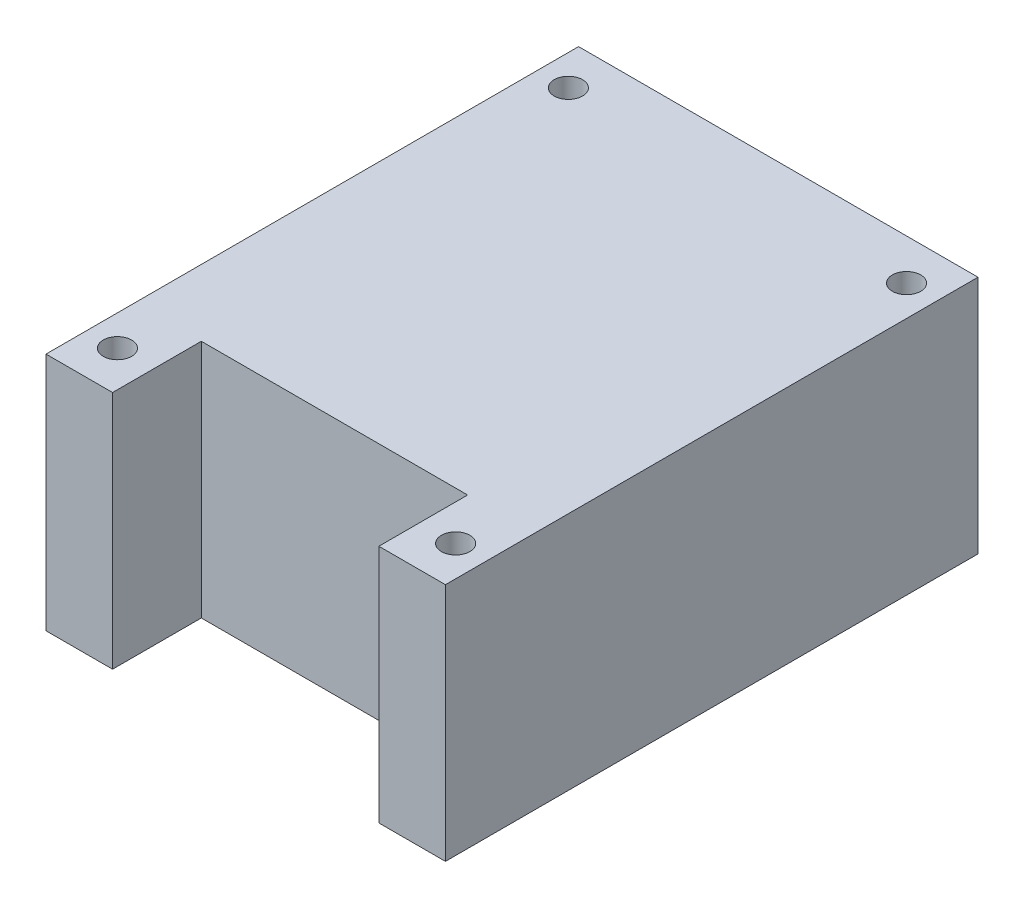
ISO-10303-21;
HEADER;
FILE_DESCRIPTION(('STEP AP214'),'2;1');
FILE_NAME('part.step','',(''),(''),'','','');
FILE_SCHEMA(('AUTOMOTIVE_DESIGN { 1 0 10303 214 1 1 1 1 }'));
ENDSEC;
DATA;
#1=APPLICATION_CONTEXT('core data for automotive mechanical design processes');
#2=APPLICATION_PROTOCOL_DEFINITION('international standard','automotive_design',2000,#1);
#3=PRODUCT_CONTEXT('',#1,'mechanical');
#4=PRODUCT('Part','Part','',(#3));
#5=PRODUCT_RELATED_PRODUCT_CATEGORY('part','',(#4));
#6=PRODUCT_DEFINITION_FORMATION('','',#4);
#7=PRODUCT_DEFINITION_CONTEXT('part definition',#1,'design');
#8=PRODUCT_DEFINITION('design','',#6,#7);
#9=PRODUCT_DEFINITION_SHAPE('','',#8);
#10=(LENGTH_UNIT() NAMED_UNIT(*) SI_UNIT(.MILLI.,.METRE.));
#11=(NAMED_UNIT(*) PLANE_ANGLE_UNIT() SI_UNIT($,.RADIAN.));
#12=(NAMED_UNIT(*) SI_UNIT($,.STERADIAN.) SOLID_ANGLE_UNIT());
#13=UNCERTAINTY_MEASURE_WITH_UNIT(LENGTH_MEASURE(1.E-05),#10,'distance_accuracy_value','');
#14=(GEOMETRIC_REPRESENTATION_CONTEXT(3) GLOBAL_UNCERTAINTY_ASSIGNED_CONTEXT((#13)) GLOBAL_UNIT_ASSIGNED_CONTEXT((#10,
#11,#12)) REPRESENTATION_CONTEXT('',''));
#15=CARTESIAN_POINT('',(0.,0.,0.));
#16=DIRECTION('',(0.,0.,1.));
#17=DIRECTION('',(1.,0.,0.));
#18=AXIS2_PLACEMENT_3D('',#15,#16,#17);
#19=CARTESIAN_POINT('',(-22.5,27.,30.));
#20=DIRECTION('',(0.,0.,-1.));
#21=DIRECTION('',(-1.,0.,0.));
#22=AXIS2_PLACEMENT_3D('',#19,#20,#21);
#23=PLANE('',#22);
#24=DIRECTION('',(1.,0.,0.));
#25=VECTOR('',#24,1.);
#26=CARTESIAN_POINT('',(-22.5,27.,30.));
#27=LINE('',#26,#25);
#28=CARTESIAN_POINT('',(15.,27.,30.));
#29=VERTEX_POINT('',#28);
#30=CARTESIAN_POINT('',(22.5,27.,30.));
#31=VERTEX_POINT('',#30);
#32=EDGE_CURVE('E64',#29,#31,#27,.T.);
#33=ORIENTED_EDGE('',*,*,#32,.F.);
#34=DIRECTION('',(0.,-1.,0.));
#35=VECTOR('',#34,1.);
#36=CARTESIAN_POINT('',(15.,58.6227766016838,30.));
#37=LINE('',#36,#35);
#38=CARTESIAN_POINT('',(15.,0.,30.));
#39=VERTEX_POINT('',#38);
#40=EDGE_CURVE('E117',#29,#39,#37,.T.);
#41=ORIENTED_EDGE('',*,*,#40,.T.);
#42=DIRECTION('',(1.,0.,0.));
#43=VECTOR('',#42,1.);
#44=CARTESIAN_POINT('',(-22.5,0.,30.));
#45=LINE('',#44,#43);
#46=CARTESIAN_POINT('',(22.5,0.,30.));
#47=VERTEX_POINT('',#46);
#48=EDGE_CURVE('E86',#39,#47,#45,.T.);
#49=ORIENTED_EDGE('',*,*,#48,.T.);
#50=DIRECTION('',(0.,-1.,0.));
#51=VECTOR('',#50,1.);
#52=CARTESIAN_POINT('',(22.5,27.,30.));
#53=LINE('',#52,#51);
#54=EDGE_CURVE('E146',#31,#47,#53,.T.);
#55=ORIENTED_EDGE('',*,*,#54,.F.);
#56=EDGE_LOOP('',(#33,#41,#49,#55));
#57=FACE_BOUND('',#56,.T.);
#58=ADVANCED_FACE('F39',(#57),#23,.F.);
#59=CARTESIAN_POINT('',(22.5,27.,30.));
#60=DIRECTION('',(-1.,0.,0.));
#61=DIRECTION('',(0.,0.,1.));
#62=AXIS2_PLACEMENT_3D('',#59,#60,#61);
#63=PLANE('',#62);
#64=DIRECTION('',(0.,0.,-1.));
#65=VECTOR('',#64,1.);
#66=CARTESIAN_POINT('',(22.5,0.,30.));
#67=LINE('',#66,#65);
#68=CARTESIAN_POINT('',(22.5,0.,-30.));
#69=VERTEX_POINT('',#68);
#70=EDGE_CURVE('E133',#47,#69,#67,.T.);
#71=ORIENTED_EDGE('',*,*,#70,.T.);
#72=DIRECTION('',(0.,-1.,0.));
#73=VECTOR('',#72,1.);
#74=CARTESIAN_POINT('',(22.5,27.,-30.));
#75=LINE('',#74,#73);
#76=CARTESIAN_POINT('',(22.5,27.,-30.));
#77=VERTEX_POINT('',#76);
#78=EDGE_CURVE('E11',#77,#69,#75,.T.);
#79=ORIENTED_EDGE('',*,*,#78,.F.);
#80=DIRECTION('',(0.,0.,-1.));
#81=VECTOR('',#80,1.);
#82=CARTESIAN_POINT('',(22.5,27.,30.));
#83=LINE('',#82,#81);
#84=EDGE_CURVE('E141',#31,#77,#83,.T.);
#85=ORIENTED_EDGE('',*,*,#84,.F.);
#86=ORIENTED_EDGE('',*,*,#54,.T.);
#87=EDGE_LOOP('',(#71,#79,#85,#86));
#88=FACE_BOUND('',#87,.T.);
#89=ADVANCED_FACE('F41',(#88),#63,.F.);
#90=CARTESIAN_POINT('',(-22.5,27.,-30.));
#91=DIRECTION('',(0.,0.,1.));
#92=DIRECTION('',(1.,0.,0.));
#93=AXIS2_PLACEMENT_3D('',#90,#91,#92);
#94=PLANE('',#93);
#95=DIRECTION('',(-1.,0.,0.));
#96=VECTOR('',#95,1.);
#97=CARTESIAN_POINT('',(-22.5,0.,-30.));
#98=LINE('',#97,#96);
#99=CARTESIAN_POINT('',(-22.5,0.,-30.));
#100=VERTEX_POINT('',#99);
#101=EDGE_CURVE('E142',#69,#100,#98,.T.);
#102=ORIENTED_EDGE('',*,*,#101,.T.);
#103=DIRECTION('',(0.,-1.,0.));
#104=VECTOR('',#103,1.);
#105=CARTESIAN_POINT('',(-22.5,27.,-30.));
#106=LINE('',#105,#104);
#107=CARTESIAN_POINT('',(-22.5,27.,-30.));
#108=VERTEX_POINT('',#107);
#109=EDGE_CURVE('E48',#108,#100,#106,.T.);
#110=ORIENTED_EDGE('',*,*,#109,.F.);
#111=DIRECTION('',(-1.,0.,0.));
#112=VECTOR('',#111,1.);
#113=CARTESIAN_POINT('',(-22.5,27.,-30.));
#114=LINE('',#113,#112);
#115=EDGE_CURVE('E93',#77,#108,#114,.T.);
#116=ORIENTED_EDGE('',*,*,#115,.F.);
#117=ORIENTED_EDGE('',*,*,#78,.T.);
#118=EDGE_LOOP('',(#102,#110,#116,#117));
#119=FACE_BOUND('',#118,.T.);
#120=ADVANCED_FACE('F176',(#119),#94,.F.);
#121=CARTESIAN_POINT('',(-22.5,27.,30.));
#122=DIRECTION('',(1.,0.,0.));
#123=DIRECTION('',(0.,0.,-1.));
#124=AXIS2_PLACEMENT_3D('',#121,#122,#123);
#125=PLANE('',#124);
#126=DIRECTION('',(0.,0.,1.));
#127=VECTOR('',#126,1.);
#128=CARTESIAN_POINT('',(-22.5,0.,30.));
#129=LINE('',#128,#127);
#130=CARTESIAN_POINT('',(-22.5,0.,30.));
#131=VERTEX_POINT('',#130);
#132=EDGE_CURVE('E136',#100,#131,#129,.T.);
#133=ORIENTED_EDGE('',*,*,#132,.T.);
#134=DIRECTION('',(0.,-1.,0.));
#135=VECTOR('',#134,1.);
#136=CARTESIAN_POINT('',(-22.5,27.,30.));
#137=LINE('',#136,#135);
#138=CARTESIAN_POINT('',(-22.5,27.,30.));
#139=VERTEX_POINT('',#138);
#140=EDGE_CURVE('E149',#139,#131,#137,.T.);
#141=ORIENTED_EDGE('',*,*,#140,.F.);
#142=DIRECTION('',(0.,0.,1.));
#143=VECTOR('',#142,1.);
#144=CARTESIAN_POINT('',(-22.5,27.,30.));
#145=LINE('',#144,#143);
#146=EDGE_CURVE('E160',#108,#139,#145,.T.);
#147=ORIENTED_EDGE('',*,*,#146,.F.);
#148=ORIENTED_EDGE('',*,*,#109,.T.);
#149=EDGE_LOOP('',(#133,#141,#147,#148));
#150=FACE_BOUND('',#149,.T.);
#151=ADVANCED_FACE('F158',(#150),#125,.F.);
#152=CARTESIAN_POINT('',(-15.,0.,30.));
#153=VERTEX_POINT('',#152);
#154=EDGE_CURVE('E135',#131,#153,#45,.T.);
#155=ORIENTED_EDGE('',*,*,#154,.T.);
#156=DIRECTION('',(0.,-1.,0.));
#157=VECTOR('',#156,1.);
#158=CARTESIAN_POINT('',(-15.,58.6227766016838,30.));
#159=LINE('',#158,#157);
#160=CARTESIAN_POINT('',(-15.,27.,30.));
#161=VERTEX_POINT('',#160);
#162=EDGE_CURVE('E55',#161,#153,#159,.T.);
#163=ORIENTED_EDGE('',*,*,#162,.F.);
#164=EDGE_CURVE('E150',#139,#161,#27,.T.);
#165=ORIENTED_EDGE('',*,*,#164,.F.);
#166=ORIENTED_EDGE('',*,*,#140,.T.);
#167=EDGE_LOOP('',(#155,#163,#165,#166));
#168=FACE_BOUND('',#167,.T.);
#169=ADVANCED_FACE('F163',(#168),#23,.F.);
#170=CARTESIAN_POINT('',(0.,27.,0.));
#171=DIRECTION('',(0.,-1.,0.));
#172=DIRECTION('',(0.,0.,-1.));
#173=AXIS2_PLACEMENT_3D('',#170,#171,#172);
#174=PLANE('',#173);
#175=CARTESIAN_POINT('',(-19.05,27.,-25.4));
#176=DIRECTION('',(0.,1.,0.));
#177=DIRECTION('',(0.,0.,1.));
#178=AXIS2_PLACEMENT_3D('',#175,#176,#177);
#179=CIRCLE('',#178,1.6);
#180=CARTESIAN_POINT('',(-19.05,27.,-23.8));
#181=VERTEX_POINT('',#180);
#182=EDGE_CURVE('E211',#181,#181,#179,.T.);
#183=ORIENTED_EDGE('',*,*,#182,.F.);
#184=EDGE_LOOP('',(#183));
#185=FACE_BOUND('',#184,.T.);
#186=CARTESIAN_POINT('',(19.05,27.,-25.4));
#187=DIRECTION('',(0.,1.,0.));
#188=DIRECTION('',(0.,0.,1.));
#189=AXIS2_PLACEMENT_3D('',#186,#187,#188);
#190=CIRCLE('',#189,1.6);
#191=CARTESIAN_POINT('',(19.05,27.,-23.8));
#192=VERTEX_POINT('',#191);
#193=EDGE_CURVE('E203',#192,#192,#190,.T.);
#194=ORIENTED_EDGE('',*,*,#193,.F.);
#195=EDGE_LOOP('',(#194));
#196=FACE_BOUND('',#195,.T.);
#197=CARTESIAN_POINT('',(19.05,27.,25.4));
#198=DIRECTION('',(0.,1.,0.));
#199=DIRECTION('',(0.,0.,1.));
#200=AXIS2_PLACEMENT_3D('',#197,#198,#199);
#201=CIRCLE('',#200,1.6);
#202=CARTESIAN_POINT('',(19.05,27.,27.));
#203=VERTEX_POINT('',#202);
#204=EDGE_CURVE('E195',#203,#203,#201,.T.);
#205=ORIENTED_EDGE('',*,*,#204,.F.);
#206=EDGE_LOOP('',(#205));
#207=FACE_BOUND('',#206,.T.);
#208=CARTESIAN_POINT('',(-19.05,27.,25.4));
#209=DIRECTION('',(0.,1.,0.));
#210=DIRECTION('',(0.,0.,1.));
#211=AXIS2_PLACEMENT_3D('',#208,#209,#210);
#212=CIRCLE('',#211,1.6);
#213=CARTESIAN_POINT('',(-19.05,27.,27.));
#214=VERTEX_POINT('',#213);
#215=EDGE_CURVE('E187',#214,#214,#212,.T.);
#216=ORIENTED_EDGE('',*,*,#215,.F.);
#217=EDGE_LOOP('',(#216));
#218=FACE_BOUND('',#217,.T.);
#219=DIRECTION('',(-1.,0.,0.));
#220=VECTOR('',#219,1.);
#221=CARTESIAN_POINT('',(-15.,27.,20.));
#222=LINE('',#221,#220);
#223=CARTESIAN_POINT('',(15.,27.,20.));
#224=VERTEX_POINT('',#223);
#225=CARTESIAN_POINT('',(-15.,27.,20.));
#226=VERTEX_POINT('',#225);
#227=EDGE_CURVE('E230',#224,#226,#222,.T.);
#228=ORIENTED_EDGE('',*,*,#227,.F.);
#229=DIRECTION('',(0.,0.,-1.));
#230=VECTOR('',#229,1.);
#231=CARTESIAN_POINT('',(15.,27.,20.));
#232=LINE('',#231,#230);
#233=EDGE_CURVE('E214',#29,#224,#232,.T.);
#234=ORIENTED_EDGE('',*,*,#233,.F.);
#235=ORIENTED_EDGE('',*,*,#32,.T.);
#236=ORIENTED_EDGE('',*,*,#84,.T.);
#237=ORIENTED_EDGE('',*,*,#115,.T.);
#238=ORIENTED_EDGE('',*,*,#146,.T.);
#239=ORIENTED_EDGE('',*,*,#164,.T.);
#240=DIRECTION('',(0.,0.,1.));
#241=VECTOR('',#240,1.);
#242=CARTESIAN_POINT('',(-15.,27.,20.));
#243=LINE('',#242,#241);
#244=EDGE_CURVE('E223',#226,#161,#243,.T.);
#245=ORIENTED_EDGE('',*,*,#244,.F.);
#246=EDGE_LOOP('',(#228,#234,#235,#236,#237,#238,#239,#245));
#247=FACE_BOUND('',#246,.T.);
#248=ADVANCED_FACE('F237',(#185,#196,#207,#218,#247),#174,.F.);
#249=CARTESIAN_POINT('',(0.,0.,0.));
#250=DIRECTION('',(0.,-1.,0.));
#251=DIRECTION('',(0.,0.,-1.));
#252=AXIS2_PLACEMENT_3D('',#249,#250,#251);
#253=PLANE('',#252);
#254=DIRECTION('',(0.,0.,1.));
#255=VECTOR('',#254,1.);
#256=CARTESIAN_POINT('',(15.,0.,20.));
#257=LINE('',#256,#255);
#258=CARTESIAN_POINT('',(15.,0.,20.));
#259=VERTEX_POINT('',#258);
#260=EDGE_CURVE('E115',#259,#39,#257,.T.);
#261=ORIENTED_EDGE('',*,*,#260,.F.);
#262=DIRECTION('',(1.,0.,0.));
#263=VECTOR('',#262,1.);
#264=CARTESIAN_POINT('',(-15.,0.,20.));
#265=LINE('',#264,#263);
#266=CARTESIAN_POINT('',(-15.,0.,20.));
#267=VERTEX_POINT('',#266);
#268=EDGE_CURVE('E127',#267,#259,#265,.T.);
#269=ORIENTED_EDGE('',*,*,#268,.F.);
#270=DIRECTION('',(0.,0.,-1.));
#271=VECTOR('',#270,1.);
#272=CARTESIAN_POINT('',(-15.,0.,20.));
#273=LINE('',#272,#271);
#274=EDGE_CURVE('E124',#153,#267,#273,.T.);
#275=ORIENTED_EDGE('',*,*,#274,.F.);
#276=ORIENTED_EDGE('',*,*,#154,.F.);
#277=ORIENTED_EDGE('',*,*,#132,.F.);
#278=ORIENTED_EDGE('',*,*,#101,.F.);
#279=ORIENTED_EDGE('',*,*,#70,.F.);
#280=ORIENTED_EDGE('',*,*,#48,.F.);
#281=EDGE_LOOP('',(#261,#269,#275,#276,#277,#278,#279,#280));
#282=FACE_BOUND('',#281,.T.);
#283=CARTESIAN_POINT('',(-19.05,0.,-25.4));
#284=DIRECTION('',(0.,1.,0.));
#285=DIRECTION('',(0.,0.,1.));
#286=AXIS2_PLACEMENT_3D('',#283,#284,#285);
#287=CIRCLE('',#286,1.59999999999999);
#288=CARTESIAN_POINT('',(-19.05,0.,-23.8));
#289=VERTEX_POINT('',#288);
#290=EDGE_CURVE('E207',#289,#289,#287,.T.);
#291=ORIENTED_EDGE('',*,*,#290,.T.);
#292=EDGE_LOOP('',(#291));
#293=FACE_BOUND('',#292,.T.);
#294=CARTESIAN_POINT('',(19.05,0.,-25.4));
#295=DIRECTION('',(0.,1.,0.));
#296=DIRECTION('',(0.,0.,1.));
#297=AXIS2_PLACEMENT_3D('',#294,#295,#296);
#298=CIRCLE('',#297,1.59999999999999);
#299=CARTESIAN_POINT('',(19.05,0.,-23.8));
#300=VERTEX_POINT('',#299);
#301=EDGE_CURVE('E199',#300,#300,#298,.T.);
#302=ORIENTED_EDGE('',*,*,#301,.T.);
#303=EDGE_LOOP('',(#302));
#304=FACE_BOUND('',#303,.T.);
#305=CARTESIAN_POINT('',(19.05,0.,25.4));
#306=DIRECTION('',(0.,1.,0.));
#307=DIRECTION('',(0.,0.,1.));
#308=AXIS2_PLACEMENT_3D('',#305,#306,#307);
#309=CIRCLE('',#308,1.59999999999999);
#310=CARTESIAN_POINT('',(19.05,0.,27.));
#311=VERTEX_POINT('',#310);
#312=EDGE_CURVE('E191',#311,#311,#309,.T.);
#313=ORIENTED_EDGE('',*,*,#312,.T.);
#314=EDGE_LOOP('',(#313));
#315=FACE_BOUND('',#314,.T.);
#316=CARTESIAN_POINT('',(-19.05,0.,25.4));
#317=DIRECTION('',(0.,1.,0.));
#318=DIRECTION('',(0.,0.,1.));
#319=AXIS2_PLACEMENT_3D('',#316,#317,#318);
#320=CIRCLE('',#319,1.59999999999999);
#321=CARTESIAN_POINT('',(-19.05,0.,27.));
#322=VERTEX_POINT('',#321);
#323=EDGE_CURVE('E174',#322,#322,#320,.T.);
#324=ORIENTED_EDGE('',*,*,#323,.T.);
#325=EDGE_LOOP('',(#324));
#326=FACE_BOUND('',#325,.T.);
#327=ADVANCED_FACE('F130',(#282,#293,#304,#315,#326),#253,.T.);
#328=CARTESIAN_POINT('',(-19.05,27.,25.4));
#329=DIRECTION('',(0.,1.,0.));
#330=DIRECTION('',(0.,0.,1.));
#331=AXIS2_PLACEMENT_3D('',#328,#329,#330);
#332=CYLINDRICAL_SURFACE('',#331,1.6);
#333=ORIENTED_EDGE('',*,*,#323,.F.);
#334=EDGE_LOOP('',(#333));
#335=FACE_BOUND('',#334,.T.);
#336=ORIENTED_EDGE('',*,*,#215,.T.);
#337=EDGE_LOOP('',(#336));
#338=FACE_BOUND('',#337,.T.);
#339=ADVANCED_FACE('F298',(#335,#338),#332,.F.);
#340=CARTESIAN_POINT('',(19.05,27.,25.4));
#341=DIRECTION('',(0.,1.,0.));
#342=DIRECTION('',(0.,0.,1.));
#343=AXIS2_PLACEMENT_3D('',#340,#341,#342);
#344=CYLINDRICAL_SURFACE('',#343,1.6);
#345=ORIENTED_EDGE('',*,*,#312,.F.);
#346=EDGE_LOOP('',(#345));
#347=FACE_BOUND('',#346,.T.);
#348=ORIENTED_EDGE('',*,*,#204,.T.);
#349=EDGE_LOOP('',(#348));
#350=FACE_BOUND('',#349,.T.);
#351=ADVANCED_FACE('F305',(#347,#350),#344,.F.);
#352=CARTESIAN_POINT('',(19.05,27.,-25.4));
#353=DIRECTION('',(0.,1.,0.));
#354=DIRECTION('',(0.,0.,1.));
#355=AXIS2_PLACEMENT_3D('',#352,#353,#354);
#356=CYLINDRICAL_SURFACE('',#355,1.6);
#357=ORIENTED_EDGE('',*,*,#301,.F.);
#358=EDGE_LOOP('',(#357));
#359=FACE_BOUND('',#358,.T.);
#360=ORIENTED_EDGE('',*,*,#193,.T.);
#361=EDGE_LOOP('',(#360));
#362=FACE_BOUND('',#361,.T.);
#363=ADVANCED_FACE('F314',(#359,#362),#356,.F.);
#364=CARTESIAN_POINT('',(-19.05,27.,-25.4));
#365=DIRECTION('',(0.,1.,0.));
#366=DIRECTION('',(0.,0.,1.));
#367=AXIS2_PLACEMENT_3D('',#364,#365,#366);
#368=CYLINDRICAL_SURFACE('',#367,1.6);
#369=ORIENTED_EDGE('',*,*,#290,.F.);
#370=EDGE_LOOP('',(#369));
#371=FACE_BOUND('',#370,.T.);
#372=ORIENTED_EDGE('',*,*,#182,.T.);
#373=EDGE_LOOP('',(#372));
#374=FACE_BOUND('',#373,.T.);
#375=ADVANCED_FACE('F247',(#371,#374),#368,.F.);
#376=CARTESIAN_POINT('',(15.,58.6227766016838,20.));
#377=DIRECTION('',(1.,0.,0.));
#378=DIRECTION('',(0.,0.,-1.));
#379=AXIS2_PLACEMENT_3D('',#376,#377,#378);
#380=PLANE('',#379);
#381=ORIENTED_EDGE('',*,*,#233,.T.);
#382=DIRECTION('',(0.,-1.,0.));
#383=VECTOR('',#382,1.);
#384=CARTESIAN_POINT('',(15.,58.6227766016838,20.));
#385=LINE('',#384,#383);
#386=EDGE_CURVE('E119',#224,#259,#385,.T.);
#387=ORIENTED_EDGE('',*,*,#386,.T.);
#388=ORIENTED_EDGE('',*,*,#260,.T.);
#389=ORIENTED_EDGE('',*,*,#40,.F.);
#390=EDGE_LOOP('',(#381,#387,#388,#389));
#391=FACE_BOUND('',#390,.T.);
#392=ADVANCED_FACE('F116',(#391),#380,.F.);
#393=CARTESIAN_POINT('',(-15.,58.6227766016838,20.));
#394=DIRECTION('',(0.,0.,-1.));
#395=DIRECTION('',(-1.,0.,0.));
#396=AXIS2_PLACEMENT_3D('',#393,#394,#395);
#397=PLANE('',#396);
#398=ORIENTED_EDGE('',*,*,#227,.T.);
#399=DIRECTION('',(0.,-1.,0.));
#400=VECTOR('',#399,1.);
#401=CARTESIAN_POINT('',(-15.,58.6227766016838,20.));
#402=LINE('',#401,#400);
#403=EDGE_CURVE('E218',#226,#267,#402,.T.);
#404=ORIENTED_EDGE('',*,*,#403,.T.);
#405=ORIENTED_EDGE('',*,*,#268,.T.);
#406=ORIENTED_EDGE('',*,*,#386,.F.);
#407=EDGE_LOOP('',(#398,#404,#405,#406));
#408=FACE_BOUND('',#407,.T.);
#409=ADVANCED_FACE('F239',(#408),#397,.F.);
#410=CARTESIAN_POINT('',(-15.,58.6227766016838,20.));
#411=DIRECTION('',(-1.,0.,0.));
#412=DIRECTION('',(0.,0.,1.));
#413=AXIS2_PLACEMENT_3D('',#410,#411,#412);
#414=PLANE('',#413);
#415=ORIENTED_EDGE('',*,*,#244,.T.);
#416=ORIENTED_EDGE('',*,*,#162,.T.);
#417=ORIENTED_EDGE('',*,*,#274,.T.);
#418=ORIENTED_EDGE('',*,*,#403,.F.);
#419=EDGE_LOOP('',(#415,#416,#417,#418));
#420=FACE_BOUND('',#419,.T.);
#421=ADVANCED_FACE('F235',(#420),#414,.F.);
#422=CLOSED_SHELL('',(#58,#89,#120,#151,#169,#248,#327,#339,#351,#363,#375,#392,#409,#421));
#423=MANIFOLD_SOLID_BREP('B2',#422);
#424=ADVANCED_BREP_SHAPE_REPRESENTATION('',(#18,#423),#14);
#425=SHAPE_DEFINITION_REPRESENTATION(#9,#424);
ENDSEC;
END-ISO-10303-21;
